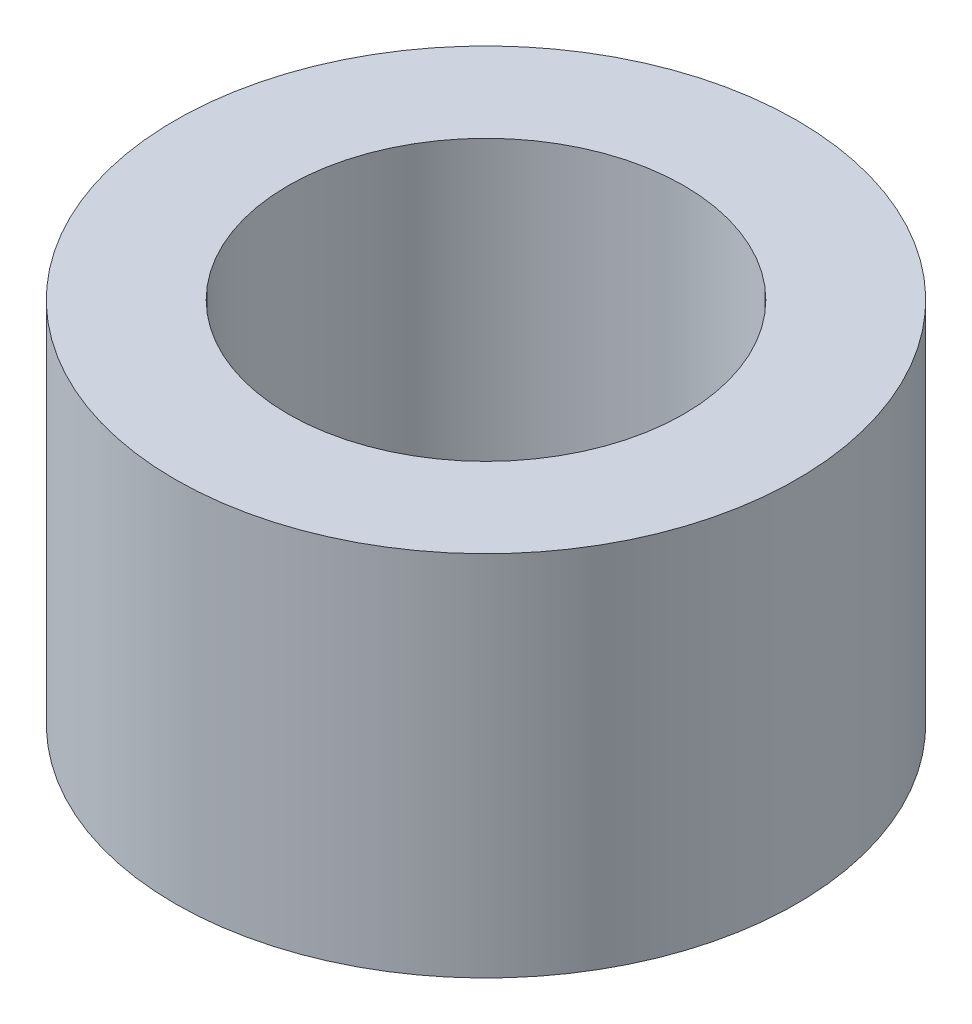
ISO-10303-21;
HEADER;
FILE_DESCRIPTION(('STEP AP214'),'2;1');
FILE_NAME('part.step','',(''),(''),'','','');
FILE_SCHEMA(('AUTOMOTIVE_DESIGN { 1 0 10303 214 1 1 1 1 }'));
ENDSEC;
DATA;
#1=APPLICATION_CONTEXT('core data for automotive mechanical design processes');
#2=APPLICATION_PROTOCOL_DEFINITION('international standard','automotive_design',2000,#1);
#3=PRODUCT_CONTEXT('',#1,'mechanical');
#4=PRODUCT('Part','Part','',(#3));
#5=PRODUCT_RELATED_PRODUCT_CATEGORY('part','',(#4));
#6=PRODUCT_DEFINITION_FORMATION('','',#4);
#7=PRODUCT_DEFINITION_CONTEXT('part definition',#1,'design');
#8=PRODUCT_DEFINITION('design','',#6,#7);
#9=PRODUCT_DEFINITION_SHAPE('','',#8);
#10=(LENGTH_UNIT() NAMED_UNIT(*) SI_UNIT(.MILLI.,.METRE.));
#11=(NAMED_UNIT(*) PLANE_ANGLE_UNIT() SI_UNIT($,.RADIAN.));
#12=(NAMED_UNIT(*) SI_UNIT($,.STERADIAN.) SOLID_ANGLE_UNIT());
#13=UNCERTAINTY_MEASURE_WITH_UNIT(LENGTH_MEASURE(1.E-05),#10,'distance_accuracy_value','');
#14=(GEOMETRIC_REPRESENTATION_CONTEXT(3) GLOBAL_UNCERTAINTY_ASSIGNED_CONTEXT((#13)) GLOBAL_UNIT_ASSIGNED_CONTEXT((#10,
#11,#12)) REPRESENTATION_CONTEXT('',''));
#15=CARTESIAN_POINT('',(0.,0.,0.));
#16=DIRECTION('',(0.,0.,1.));
#17=DIRECTION('',(1.,0.,0.));
#18=AXIS2_PLACEMENT_3D('',#15,#16,#17);
#19=CARTESIAN_POINT('',(0.,13.,0.));
#20=DIRECTION('',(0.,1.,0.));
#21=DIRECTION('',(0.,0.,1.));
#22=AXIS2_PLACEMENT_3D('',#19,#20,#21);
#23=PLANE('',#22);
#24=CARTESIAN_POINT('',(0.,13.,0.));
#25=DIRECTION('',(0.,1.,0.));
#26=DIRECTION('',(0.,0.,1.));
#27=AXIS2_PLACEMENT_3D('',#24,#25,#26);
#28=CIRCLE('',#27,11.);
#29=CARTESIAN_POINT('',(0.,13.,-11.));
#30=VERTEX_POINT('',#29);
#31=EDGE_CURVE('E10',#30,#30,#28,.T.);
#32=ORIENTED_EDGE('',*,*,#31,.T.);
#33=EDGE_LOOP('',(#32));
#34=FACE_BOUND('',#33,.T.);
#35=CARTESIAN_POINT('',(0.,13.,0.));
#36=DIRECTION('',(0.,1.,0.));
#37=DIRECTION('',(0.,0.,1.));
#38=AXIS2_PLACEMENT_3D('',#35,#36,#37);
#39=CIRCLE('',#38,7.);
#40=CARTESIAN_POINT('',(0.,13.,-7.));
#41=VERTEX_POINT('',#40);
#42=EDGE_CURVE('E41',#41,#41,#39,.T.);
#43=ORIENTED_EDGE('',*,*,#42,.F.);
#44=EDGE_LOOP('',(#43));
#45=FACE_BOUND('',#44,.T.);
#46=ADVANCED_FACE('F30',(#34,#45),#23,.T.);
#47=CARTESIAN_POINT('',(0.,0.,0.));
#48=DIRECTION('',(0.,1.,0.));
#49=DIRECTION('',(0.,0.,1.));
#50=AXIS2_PLACEMENT_3D('',#47,#48,#49);
#51=PLANE('',#50);
#52=CARTESIAN_POINT('',(0.,0.,0.));
#53=DIRECTION('',(0.,1.,0.));
#54=DIRECTION('',(0.,0.,1.));
#55=AXIS2_PLACEMENT_3D('',#52,#53,#54);
#56=CIRCLE('',#55,11.);
#57=CARTESIAN_POINT('',(0.,0.,-11.));
#58=VERTEX_POINT('',#57);
#59=EDGE_CURVE('E34',#58,#58,#56,.T.);
#60=ORIENTED_EDGE('',*,*,#59,.F.);
#61=EDGE_LOOP('',(#60));
#62=FACE_BOUND('',#61,.T.);
#63=CARTESIAN_POINT('',(0.,0.,0.));
#64=DIRECTION('',(0.,1.,0.));
#65=DIRECTION('',(0.,0.,1.));
#66=AXIS2_PLACEMENT_3D('',#63,#64,#65);
#67=CIRCLE('',#66,7.);
#68=CARTESIAN_POINT('',(0.,0.,-7.));
#69=VERTEX_POINT('',#68);
#70=EDGE_CURVE('E43',#69,#69,#67,.T.);
#71=ORIENTED_EDGE('',*,*,#70,.T.);
#72=EDGE_LOOP('',(#71));
#73=FACE_BOUND('',#72,.T.);
#74=ADVANCED_FACE('F53',(#62,#73),#51,.F.);
#75=CARTESIAN_POINT('',(0.,13.,0.));
#76=DIRECTION('',(0.,-1.,0.));
#77=DIRECTION('',(0.,0.,-1.));
#78=AXIS2_PLACEMENT_3D('',#75,#76,#77);
#79=CYLINDRICAL_SURFACE('',#78,11.);
#80=CARTESIAN_POINT('',(0.,13.,-11.));
#81=CARTESIAN_POINT('',(0.,12.8645833333333,-11.));
#82=CARTESIAN_POINT('',(0.,12.7291666666667,-11.));
#83=CARTESIAN_POINT('',(0.,12.4583333333333,-11.));
#84=CARTESIAN_POINT('',(0.,12.3229166666667,-11.));
#85=CARTESIAN_POINT('',(0.,12.0520833333333,-11.));
#86=CARTESIAN_POINT('',(0.,11.9166666666667,-11.));
#87=CARTESIAN_POINT('',(0.,11.6458333333333,-11.));
#88=CARTESIAN_POINT('',(0.,11.5104166666667,-11.));
#89=CARTESIAN_POINT('',(0.,11.2395833333333,-11.));
#90=CARTESIAN_POINT('',(0.,11.1041666666667,-11.));
#91=CARTESIAN_POINT('',(0.,10.8333333333333,-11.));
#92=CARTESIAN_POINT('',(0.,10.6979166666667,-11.));
#93=CARTESIAN_POINT('',(0.,10.4270833333333,-11.));
#94=CARTESIAN_POINT('',(0.,10.2916666666667,-11.));
#95=CARTESIAN_POINT('',(0.,10.0208333333333,-11.));
#96=CARTESIAN_POINT('',(0.,9.88541666666667,-11.));
#97=CARTESIAN_POINT('',(0.,9.61458333333333,-11.));
#98=CARTESIAN_POINT('',(0.,9.47916666666667,-11.));
#99=CARTESIAN_POINT('',(0.,9.20833333333333,-11.));
#100=CARTESIAN_POINT('',(0.,9.07291666666666,-11.));
#101=CARTESIAN_POINT('',(0.,8.80208333333333,-11.));
#102=CARTESIAN_POINT('',(0.,8.66666666666667,-11.));
#103=CARTESIAN_POINT('',(0.,8.39583333333333,-11.));
#104=CARTESIAN_POINT('',(0.,8.26041666666667,-11.));
#105=CARTESIAN_POINT('',(0.,7.98958333333333,-11.));
#106=CARTESIAN_POINT('',(0.,7.85416666666667,-11.));
#107=CARTESIAN_POINT('',(0.,7.58333333333333,-11.));
#108=CARTESIAN_POINT('',(0.,7.44791666666667,-11.));
#109=CARTESIAN_POINT('',(0.,7.17708333333333,-11.));
#110=CARTESIAN_POINT('',(0.,7.04166666666667,-11.));
#111=CARTESIAN_POINT('',(0.,6.77083333333333,-11.));
#112=CARTESIAN_POINT('',(0.,6.63541666666667,-11.));
#113=CARTESIAN_POINT('',(0.,6.36458333333333,-11.));
#114=CARTESIAN_POINT('',(0.,6.22916666666667,-11.));
#115=CARTESIAN_POINT('',(0.,5.95833333333333,-11.));
#116=CARTESIAN_POINT('',(0.,5.82291666666667,-11.));
#117=CARTESIAN_POINT('',(0.,5.55208333333333,-11.));
#118=CARTESIAN_POINT('',(0.,5.41666666666667,-11.));
#119=CARTESIAN_POINT('',(0.,5.14583333333333,-11.));
#120=CARTESIAN_POINT('',(0.,5.01041666666667,-11.));
#121=CARTESIAN_POINT('',(0.,4.73958333333333,-11.));
#122=CARTESIAN_POINT('',(0.,4.60416666666667,-11.));
#123=CARTESIAN_POINT('',(0.,4.33333333333333,-11.));
#124=CARTESIAN_POINT('',(0.,4.19791666666667,-11.));
#125=CARTESIAN_POINT('',(0.,3.92708333333333,-11.));
#126=CARTESIAN_POINT('',(0.,3.79166666666667,-11.));
#127=CARTESIAN_POINT('',(0.,3.52083333333333,-11.));
#128=CARTESIAN_POINT('',(0.,3.38541666666667,-11.));
#129=CARTESIAN_POINT('',(0.,3.11458333333333,-11.));
#130=CARTESIAN_POINT('',(0.,2.97916666666667,-11.));
#131=CARTESIAN_POINT('',(0.,2.70833333333333,-11.));
#132=CARTESIAN_POINT('',(0.,2.57291666666667,-11.));
#133=CARTESIAN_POINT('',(0.,2.30208333333333,-11.));
#134=CARTESIAN_POINT('',(0.,2.16666666666667,-11.));
#135=CARTESIAN_POINT('',(0.,1.89583333333333,-11.));
#136=CARTESIAN_POINT('',(0.,1.76041666666667,-11.));
#137=CARTESIAN_POINT('',(0.,1.48958333333333,-11.));
#138=CARTESIAN_POINT('',(0.,1.35416666666667,-11.));
#139=CARTESIAN_POINT('',(0.,1.08333333333333,-11.));
#140=CARTESIAN_POINT('',(0.,0.947916666666667,-11.));
#141=CARTESIAN_POINT('',(0.,0.677083333333334,-11.));
#142=CARTESIAN_POINT('',(0.,0.541666666666667,-11.));
#143=CARTESIAN_POINT('',(0.,0.270833333333334,-11.));
#144=CARTESIAN_POINT('',(0.,0.135416666666667,-11.));
#145=CARTESIAN_POINT('',(0.,0.,-11.));
#146=B_SPLINE_CURVE_WITH_KNOTS('',3,(#80,#81,#82,#83,#84,#85,#86,#87,#88,#89,#90,#91,#92,#93,
#94,#95,#96,#97,#98,#99,#100,#101,#102,#103,#104,#105,#106,#107,#108,#109,#110,#111,#112,#113,
#114,#115,#116,#117,#118,#119,#120,#121,#122,#123,#124,#125,#126,#127,#128,#129,#130,#131,#132,
#133,#134,#135,#136,#137,#138,#139,#140,#141,#142,#143,#144,#145),.UNSPECIFIED.,.F.,.F.,(4,2,2,
2,2,2,2,2,2,2,2,2,2,2,2,2,2,2,2,2,2,2,2,2,2,2,2,2,2,2,2,2,4),(0.,0.40625,0.812500000000001,
1.21875,1.625,2.03125,2.4375,2.84375,3.25,3.65625,4.0625,4.46875,4.875,5.28125,5.6875,6.09375,
6.5,6.90625,7.3125,7.71875,8.125,8.53125,8.9375,9.34375,9.75,10.15625,10.5625,10.96875,11.375,
11.78125,12.1875,12.59375,13.),.UNSPECIFIED.);
#147=EDGE_CURVE('BSEAM32',#30,#58,#146,.T.);
#148=ORIENTED_EDGE('',*,*,#31,.F.);
#149=ORIENTED_EDGE('',*,*,#59,.T.);
#150=ORIENTED_EDGE('',*,*,#147,.T.);
#151=ORIENTED_EDGE('',*,*,#147,.F.);
#152=EDGE_LOOP('',(#148,#150,#149,#151));
#153=FACE_BOUND('',#152,.T.);
#154=ADVANCED_FACE('F32',(#153),#79,.T.);
#155=CARTESIAN_POINT('',(0.,13.,0.));
#156=DIRECTION('',(0.,-1.,0.));
#157=DIRECTION('',(0.,0.,-1.));
#158=AXIS2_PLACEMENT_3D('',#155,#156,#157);
#159=CYLINDRICAL_SURFACE('',#158,7.);
#160=CARTESIAN_POINT('',(0.,13.,-7.));
#161=CARTESIAN_POINT('',(0.,12.8645833333333,-7.));
#162=CARTESIAN_POINT('',(0.,12.7291666666667,-7.));
#163=CARTESIAN_POINT('',(0.,12.4583333333333,-7.));
#164=CARTESIAN_POINT('',(0.,12.3229166666667,-7.));
#165=CARTESIAN_POINT('',(0.,12.0520833333333,-7.));
#166=CARTESIAN_POINT('',(0.,11.9166666666667,-7.));
#167=CARTESIAN_POINT('',(0.,11.6458333333333,-7.));
#168=CARTESIAN_POINT('',(0.,11.5104166666667,-7.));
#169=CARTESIAN_POINT('',(0.,11.2395833333333,-7.));
#170=CARTESIAN_POINT('',(0.,11.1041666666667,-7.));
#171=CARTESIAN_POINT('',(0.,10.8333333333333,-7.));
#172=CARTESIAN_POINT('',(0.,10.6979166666667,-7.));
#173=CARTESIAN_POINT('',(0.,10.4270833333333,-7.));
#174=CARTESIAN_POINT('',(0.,10.2916666666667,-7.));
#175=CARTESIAN_POINT('',(0.,10.0208333333333,-7.));
#176=CARTESIAN_POINT('',(0.,9.88541666666667,-7.));
#177=CARTESIAN_POINT('',(0.,9.61458333333333,-7.));
#178=CARTESIAN_POINT('',(0.,9.47916666666667,-7.));
#179=CARTESIAN_POINT('',(0.,9.20833333333333,-7.));
#180=CARTESIAN_POINT('',(0.,9.07291666666667,-7.));
#181=CARTESIAN_POINT('',(0.,8.80208333333333,-7.));
#182=CARTESIAN_POINT('',(0.,8.66666666666667,-7.));
#183=CARTESIAN_POINT('',(0.,8.39583333333333,-7.));
#184=CARTESIAN_POINT('',(0.,8.26041666666667,-7.));
#185=CARTESIAN_POINT('',(0.,7.98958333333333,-7.));
#186=CARTESIAN_POINT('',(0.,7.85416666666667,-7.));
#187=CARTESIAN_POINT('',(0.,7.58333333333333,-7.));
#188=CARTESIAN_POINT('',(0.,7.44791666666667,-7.));
#189=CARTESIAN_POINT('',(0.,7.17708333333333,-7.));
#190=CARTESIAN_POINT('',(0.,7.04166666666667,-7.));
#191=CARTESIAN_POINT('',(0.,6.77083333333333,-7.));
#192=CARTESIAN_POINT('',(0.,6.63541666666667,-7.));
#193=CARTESIAN_POINT('',(0.,6.36458333333333,-7.));
#194=CARTESIAN_POINT('',(0.,6.22916666666667,-7.));
#195=CARTESIAN_POINT('',(0.,5.95833333333333,-7.));
#196=CARTESIAN_POINT('',(0.,5.82291666666667,-7.));
#197=CARTESIAN_POINT('',(0.,5.55208333333333,-7.));
#198=CARTESIAN_POINT('',(0.,5.41666666666667,-7.));
#199=CARTESIAN_POINT('',(0.,5.14583333333333,-7.));
#200=CARTESIAN_POINT('',(0.,5.01041666666667,-7.));
#201=CARTESIAN_POINT('',(0.,4.73958333333333,-7.));
#202=CARTESIAN_POINT('',(0.,4.60416666666667,-7.));
#203=CARTESIAN_POINT('',(0.,4.33333333333333,-7.));
#204=CARTESIAN_POINT('',(0.,4.19791666666667,-7.));
#205=CARTESIAN_POINT('',(0.,3.92708333333333,-7.));
#206=CARTESIAN_POINT('',(0.,3.79166666666667,-7.));
#207=CARTESIAN_POINT('',(0.,3.52083333333333,-7.));
#208=CARTESIAN_POINT('',(0.,3.38541666666667,-7.));
#209=CARTESIAN_POINT('',(0.,3.11458333333333,-7.));
#210=CARTESIAN_POINT('',(0.,2.97916666666667,-7.));
#211=CARTESIAN_POINT('',(0.,2.70833333333333,-7.));
#212=CARTESIAN_POINT('',(0.,2.57291666666667,-7.));
#213=CARTESIAN_POINT('',(0.,2.30208333333333,-7.));
#214=CARTESIAN_POINT('',(0.,2.16666666666667,-7.));
#215=CARTESIAN_POINT('',(0.,1.89583333333333,-7.));
#216=CARTESIAN_POINT('',(0.,1.76041666666667,-7.));
#217=CARTESIAN_POINT('',(0.,1.48958333333333,-7.));
#218=CARTESIAN_POINT('',(0.,1.35416666666667,-7.));
#219=CARTESIAN_POINT('',(0.,1.08333333333333,-7.));
#220=CARTESIAN_POINT('',(0.,0.947916666666667,-7.));
#221=CARTESIAN_POINT('',(0.,0.677083333333334,-7.));
#222=CARTESIAN_POINT('',(0.,0.541666666666667,-7.));
#223=CARTESIAN_POINT('',(0.,0.270833333333334,-7.));
#224=CARTESIAN_POINT('',(0.,0.135416666666667,-7.));
#225=CARTESIAN_POINT('',(0.,0.,-7.));
#226=B_SPLINE_CURVE_WITH_KNOTS('',3,(#160,#161,#162,#163,#164,#165,#166,#167,#168,#169,#170,
#171,#172,#173,#174,#175,#176,#177,#178,#179,#180,#181,#182,#183,#184,#185,#186,#187,#188,#189,
#190,#191,#192,#193,#194,#195,#196,#197,#198,#199,#200,#201,#202,#203,#204,#205,#206,#207,#208,
#209,#210,#211,#212,#213,#214,#215,#216,#217,#218,#219,#220,#221,#222,#223,#224,#225),
.UNSPECIFIED.,.F.,.F.,(4,2,2,2,2,2,2,2,2,2,2,2,2,2,2,2,2,2,2,2,2,2,2,2,2,2,2,2,2,2,2,2,4),(0.,
0.406249999999999,0.812499999999999,1.21875,1.625,2.03125,2.4375,2.84375,3.25,3.65625,4.0625,
4.46875,4.875,5.28125,5.6875,6.09375,6.5,6.90625,7.3125,7.71875,8.125,8.53125,8.9375,9.34375,
9.75,10.15625,10.5625,10.96875,11.375,11.78125,12.1875,12.59375,13.),.UNSPECIFIED.);
#227=EDGE_CURVE('BSEAM49',#41,#69,#226,.T.);
#228=ORIENTED_EDGE('',*,*,#42,.T.);
#229=ORIENTED_EDGE('',*,*,#70,.F.);
#230=ORIENTED_EDGE('',*,*,#227,.T.);
#231=ORIENTED_EDGE('',*,*,#227,.F.);
#232=EDGE_LOOP('',(#228,#230,#229,#231));
#233=FACE_BOUND('',#232,.T.);
#234=ADVANCED_FACE('F49',(#233),#159,.F.);
#235=CLOSED_SHELL('',(#46,#74,#154,#234));
#236=MANIFOLD_SOLID_BREP('B2',#235);
#237=ADVANCED_BREP_SHAPE_REPRESENTATION('',(#18,#236),#14);
#238=SHAPE_DEFINITION_REPRESENTATION(#9,#237);
ENDSEC;
END-ISO-10303-21;
